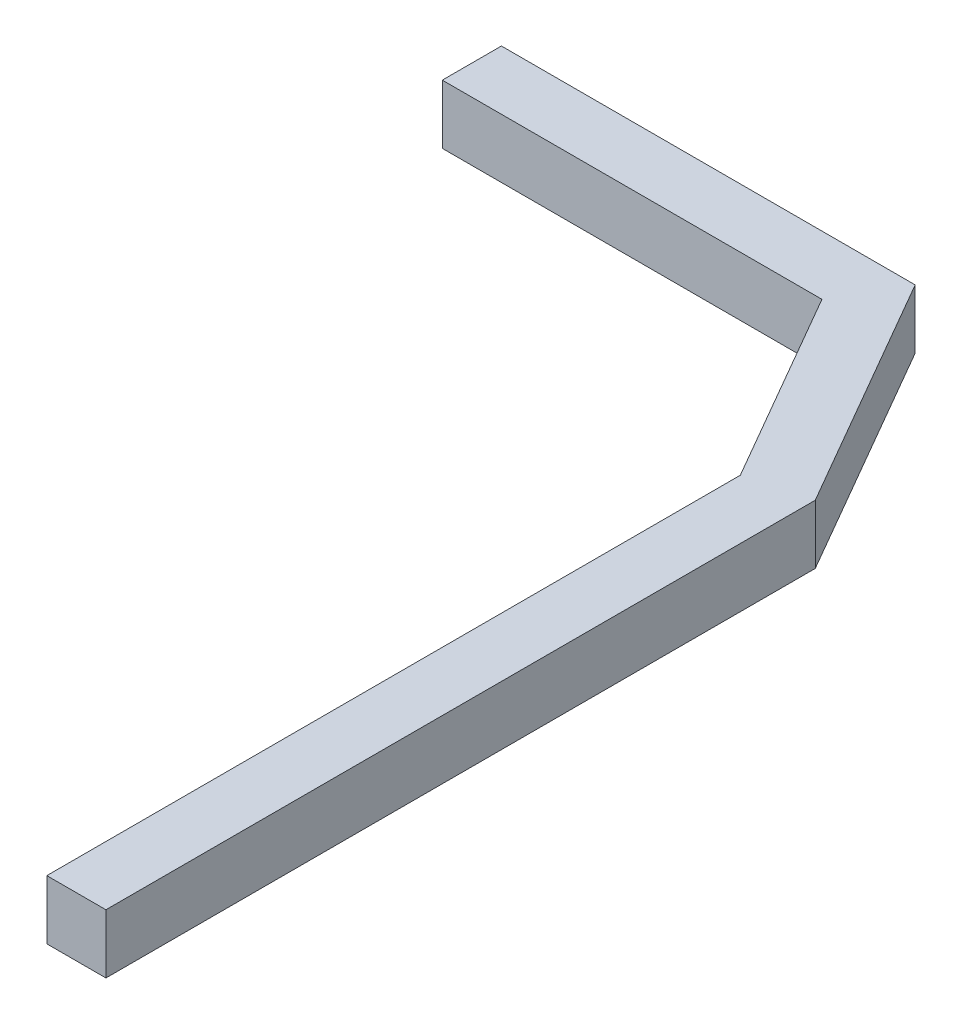
ISO-10303-21;
HEADER;
FILE_DESCRIPTION(('STEP AP214'),'2;1');
FILE_NAME('part.step','',(''),(''),'','','');
FILE_SCHEMA(('AUTOMOTIVE_DESIGN { 1 0 10303 214 1 1 1 1 }'));
ENDSEC;
DATA;
#1=APPLICATION_CONTEXT('core data for automotive mechanical design processes');
#2=APPLICATION_PROTOCOL_DEFINITION('international standard','automotive_design',2000,#1);
#3=PRODUCT_CONTEXT('',#1,'mechanical');
#4=PRODUCT('Part','Part','',(#3));
#5=PRODUCT_RELATED_PRODUCT_CATEGORY('part','',(#4));
#6=PRODUCT_DEFINITION_FORMATION('','',#4);
#7=PRODUCT_DEFINITION_CONTEXT('part definition',#1,'design');
#8=PRODUCT_DEFINITION('design','',#6,#7);
#9=PRODUCT_DEFINITION_SHAPE('','',#8);
#10=(LENGTH_UNIT() NAMED_UNIT(*) SI_UNIT(.MILLI.,.METRE.));
#11=(NAMED_UNIT(*) PLANE_ANGLE_UNIT() SI_UNIT($,.RADIAN.));
#12=(NAMED_UNIT(*) SI_UNIT($,.STERADIAN.) SOLID_ANGLE_UNIT());
#13=UNCERTAINTY_MEASURE_WITH_UNIT(LENGTH_MEASURE(1.E-05),#10,'distance_accuracy_value','');
#14=(GEOMETRIC_REPRESENTATION_CONTEXT(3) GLOBAL_UNCERTAINTY_ASSIGNED_CONTEXT((#13)) GLOBAL_UNIT_ASSIGNED_CONTEXT((#10,
#11,#12)) REPRESENTATION_CONTEXT('',''));
#15=CARTESIAN_POINT('',(0.,0.,0.));
#16=DIRECTION('',(0.,0.,1.));
#17=DIRECTION('',(1.,0.,0.));
#18=AXIS2_PLACEMENT_3D('',#15,#16,#17);
#19=CARTESIAN_POINT('',(-6.54700538379257,2.5,-80.));
#20=DIRECTION('',(0.,0.,1.));
#21=DIRECTION('',(1.,0.,0.));
#22=AXIS2_PLACEMENT_3D('',#19,#20,#21);
#23=PLANE('',#22);
#24=DIRECTION('',(-1.,0.,0.));
#25=VECTOR('',#24,1.);
#26=CARTESIAN_POINT('',(-6.54700538379257,-2.5,-80.));
#27=LINE('',#26,#25);
#28=CARTESIAN_POINT('',(-6.54700538379257,-2.5,-80.));
#29=VERTEX_POINT('',#28);
#30=CARTESIAN_POINT('',(-41.5470053837926,-2.5,-80.));
#31=VERTEX_POINT('',#30);
#32=EDGE_CURVE('E140',#29,#31,#27,.T.);
#33=ORIENTED_EDGE('',*,*,#32,.T.);
#34=DIRECTION('',(0.,-1.,0.));
#35=VECTOR('',#34,1.);
#36=CARTESIAN_POINT('',(-41.5470053837926,2.5,-80.));
#37=LINE('',#36,#35);
#38=CARTESIAN_POINT('',(-41.5470053837926,2.5,-80.));
#39=VERTEX_POINT('',#38);
#40=EDGE_CURVE('E11',#39,#31,#37,.T.);
#41=ORIENTED_EDGE('',*,*,#40,.F.);
#42=DIRECTION('',(-1.,0.,0.));
#43=VECTOR('',#42,1.);
#44=CARTESIAN_POINT('',(-6.54700538379257,2.5,-80.));
#45=LINE('',#44,#43);
#46=CARTESIAN_POINT('',(-6.54700538379257,2.5,-80.));
#47=VERTEX_POINT('',#46);
#48=EDGE_CURVE('E162',#47,#39,#45,.T.);
#49=ORIENTED_EDGE('',*,*,#48,.F.);
#50=DIRECTION('',(0.,-1.,0.));
#51=VECTOR('',#50,1.);
#52=CARTESIAN_POINT('',(-6.54700538379257,2.5,-80.));
#53=LINE('',#52,#51);
#54=EDGE_CURVE('E136',#47,#29,#53,.T.);
#55=ORIENTED_EDGE('',*,*,#54,.T.);
#56=EDGE_LOOP('',(#33,#41,#49,#55));
#57=FACE_BOUND('',#56,.T.);
#58=ADVANCED_FACE('F39',(#57),#23,.F.);
#59=CARTESIAN_POINT('',(-41.5470053837926,2.5,-80.));
#60=DIRECTION('',(1.,0.,0.));
#61=DIRECTION('',(0.,0.,-1.));
#62=AXIS2_PLACEMENT_3D('',#59,#60,#61);
#63=PLANE('',#62);
#64=DIRECTION('',(0.,0.,1.));
#65=VECTOR('',#64,1.);
#66=CARTESIAN_POINT('',(-41.5470053837926,-2.5,-80.));
#67=LINE('',#66,#65);
#68=CARTESIAN_POINT('',(-41.5470053837926,-2.5,-75.));
#69=VERTEX_POINT('',#68);
#70=EDGE_CURVE('E144',#31,#69,#67,.T.);
#71=ORIENTED_EDGE('',*,*,#70,.T.);
#72=DIRECTION('',(0.,-1.,0.));
#73=VECTOR('',#72,1.);
#74=CARTESIAN_POINT('',(-41.5470053837926,2.5,-75.));
#75=LINE('',#74,#73);
#76=CARTESIAN_POINT('',(-41.5470053837926,2.5,-75.));
#77=VERTEX_POINT('',#76);
#78=EDGE_CURVE('E48',#77,#69,#75,.T.);
#79=ORIENTED_EDGE('',*,*,#78,.F.);
#80=DIRECTION('',(0.,0.,1.));
#81=VECTOR('',#80,1.);
#82=CARTESIAN_POINT('',(-41.5470053837926,2.5,-80.));
#83=LINE('',#82,#81);
#84=EDGE_CURVE('E99',#39,#77,#83,.T.);
#85=ORIENTED_EDGE('',*,*,#84,.F.);
#86=ORIENTED_EDGE('',*,*,#40,.T.);
#87=EDGE_LOOP('',(#71,#79,#85,#86));
#88=FACE_BOUND('',#87,.T.);
#89=ADVANCED_FACE('F208',(#88),#63,.F.);
#90=CARTESIAN_POINT('',(-41.5470053837926,2.5,-75.));
#91=DIRECTION('',(0.,0.,-1.));
#92=DIRECTION('',(-1.,0.,0.));
#93=AXIS2_PLACEMENT_3D('',#90,#91,#92);
#94=PLANE('',#93);
#95=DIRECTION('',(1.,0.,0.));
#96=VECTOR('',#95,1.);
#97=CARTESIAN_POINT('',(-41.5470053837926,-2.5,-75.));
#98=LINE('',#97,#96);
#99=CARTESIAN_POINT('',(-9.43375672974069,-2.5,-75.));
#100=VERTEX_POINT('',#99);
#101=EDGE_CURVE('E147',#69,#100,#98,.T.);
#102=ORIENTED_EDGE('',*,*,#101,.T.);
#103=DIRECTION('',(0.,-1.,0.));
#104=VECTOR('',#103,1.);
#105=CARTESIAN_POINT('',(-9.43375672974069,2.5,-75.));
#106=LINE('',#105,#104);
#107=CARTESIAN_POINT('',(-9.43375672974069,2.5,-75.));
#108=VERTEX_POINT('',#107);
#109=EDGE_CURVE('E173',#108,#100,#106,.T.);
#110=ORIENTED_EDGE('',*,*,#109,.F.);
#111=DIRECTION('',(1.,0.,0.));
#112=VECTOR('',#111,1.);
#113=CARTESIAN_POINT('',(-41.5470053837926,2.5,-75.));
#114=LINE('',#113,#112);
#115=EDGE_CURVE('E183',#77,#108,#114,.T.);
#116=ORIENTED_EDGE('',*,*,#115,.F.);
#117=ORIENTED_EDGE('',*,*,#78,.T.);
#118=EDGE_LOOP('',(#102,#110,#116,#117));
#119=FACE_BOUND('',#118,.T.);
#120=ADVANCED_FACE('F181',(#119),#94,.F.);
#121=CARTESIAN_POINT('',(-9.43375672974069,2.5,-75.));
#122=DIRECTION('',(0.866025403784438,0.,-0.500000000000001));
#123=DIRECTION('',(-0.500000000000001,0.,-0.866025403784438));
#124=AXIS2_PLACEMENT_3D('',#121,#122,#123);
#125=PLANE('',#124);
#126=DIRECTION('',(0.500000000000001,0.,0.866025403784438));
#127=VECTOR('',#126,1.);
#128=CARTESIAN_POINT('',(-9.43375672974069,-2.5,-75.));
#129=LINE('',#128,#127);
#130=CARTESIAN_POINT('',(0.,-2.5,-58.6602540378444));
#131=VERTEX_POINT('',#130);
#132=EDGE_CURVE('E150',#100,#131,#129,.T.);
#133=ORIENTED_EDGE('',*,*,#132,.T.);
#134=DIRECTION('',(0.,-1.,0.));
#135=VECTOR('',#134,1.);
#136=CARTESIAN_POINT('',(0.,2.5,-58.6602540378444));
#137=LINE('',#136,#135);
#138=CARTESIAN_POINT('',(0.,2.5,-58.6602540378444));
#139=VERTEX_POINT('',#138);
#140=EDGE_CURVE('E169',#139,#131,#137,.T.);
#141=ORIENTED_EDGE('',*,*,#140,.F.);
#142=DIRECTION('',(0.500000000000001,0.,0.866025403784438));
#143=VECTOR('',#142,1.);
#144=CARTESIAN_POINT('',(-9.43375672974069,2.5,-75.));
#145=LINE('',#144,#143);
#146=EDGE_CURVE('E196',#108,#139,#145,.T.);
#147=ORIENTED_EDGE('',*,*,#146,.F.);
#148=ORIENTED_EDGE('',*,*,#109,.T.);
#149=EDGE_LOOP('',(#133,#141,#147,#148));
#150=FACE_BOUND('',#149,.T.);
#151=ADVANCED_FACE('F191',(#150),#125,.F.);
#152=CARTESIAN_POINT('',(0.,2.5,-58.6602540378444));
#153=DIRECTION('',(1.,0.,0.));
#154=DIRECTION('',(0.,0.,-1.));
#155=AXIS2_PLACEMENT_3D('',#152,#153,#154);
#156=PLANE('',#155);
#157=DIRECTION('',(0.,0.,1.));
#158=VECTOR('',#157,1.);
#159=CARTESIAN_POINT('',(0.,-2.5,-58.6602540378444));
#160=LINE('',#159,#158);
#161=CARTESIAN_POINT('',(0.,-2.5,0.));
#162=VERTEX_POINT('',#161);
#163=EDGE_CURVE('E153',#131,#162,#160,.T.);
#164=ORIENTED_EDGE('',*,*,#163,.T.);
#165=DIRECTION('',(0.,-1.,0.));
#166=VECTOR('',#165,1.);
#167=CARTESIAN_POINT('',(0.,2.5,0.));
#168=LINE('',#167,#166);
#169=CARTESIAN_POINT('',(0.,2.5,0.));
#170=VERTEX_POINT('',#169);
#171=EDGE_CURVE('E129',#170,#162,#168,.T.);
#172=ORIENTED_EDGE('',*,*,#171,.F.);
#173=DIRECTION('',(0.,0.,1.));
#174=VECTOR('',#173,1.);
#175=CARTESIAN_POINT('',(0.,2.5,-58.6602540378444));
#176=LINE('',#175,#174);
#177=EDGE_CURVE('E118',#139,#170,#176,.T.);
#178=ORIENTED_EDGE('',*,*,#177,.F.);
#179=ORIENTED_EDGE('',*,*,#140,.T.);
#180=EDGE_LOOP('',(#164,#172,#178,#179));
#181=FACE_BOUND('',#180,.T.);
#182=ADVANCED_FACE('F194',(#181),#156,.F.);
#183=CARTESIAN_POINT('',(0.,2.5,0.));
#184=DIRECTION('',(0.,0.,-1.));
#185=DIRECTION('',(-1.,0.,0.));
#186=AXIS2_PLACEMENT_3D('',#183,#184,#185);
#187=PLANE('',#186);
#188=DIRECTION('',(1.,0.,0.));
#189=VECTOR('',#188,1.);
#190=CARTESIAN_POINT('',(0.,-2.5,0.));
#191=LINE('',#190,#189);
#192=CARTESIAN_POINT('',(5.,-2.5,0.));
#193=VERTEX_POINT('',#192);
#194=EDGE_CURVE('E127',#162,#193,#191,.T.);
#195=ORIENTED_EDGE('',*,*,#194,.T.);
#196=DIRECTION('',(0.,-1.,0.));
#197=VECTOR('',#196,1.);
#198=CARTESIAN_POINT('',(5.,2.5,0.));
#199=LINE('',#198,#197);
#200=CARTESIAN_POINT('',(5.,2.5,0.));
#201=VERTEX_POINT('',#200);
#202=EDGE_CURVE('E124',#201,#193,#199,.T.);
#203=ORIENTED_EDGE('',*,*,#202,.F.);
#204=DIRECTION('',(1.,0.,0.));
#205=VECTOR('',#204,1.);
#206=CARTESIAN_POINT('',(0.,2.5,0.));
#207=LINE('',#206,#205);
#208=EDGE_CURVE('E112',#170,#201,#207,.T.);
#209=ORIENTED_EDGE('',*,*,#208,.F.);
#210=ORIENTED_EDGE('',*,*,#171,.T.);
#211=EDGE_LOOP('',(#195,#203,#209,#210));
#212=FACE_BOUND('',#211,.T.);
#213=ADVANCED_FACE('F125',(#212),#187,.F.);
#214=CARTESIAN_POINT('',(5.,2.5,0.));
#215=DIRECTION('',(-1.,0.,0.));
#216=DIRECTION('',(0.,0.,1.));
#217=AXIS2_PLACEMENT_3D('',#214,#215,#216);
#218=PLANE('',#217);
#219=DIRECTION('',(0.,0.,-1.));
#220=VECTOR('',#219,1.);
#221=CARTESIAN_POINT('',(5.,-2.5,0.));
#222=LINE('',#221,#220);
#223=CARTESIAN_POINT('',(5.,-2.5,-60.));
#224=VERTEX_POINT('',#223);
#225=EDGE_CURVE('E85',#193,#224,#222,.T.);
#226=ORIENTED_EDGE('',*,*,#225,.T.);
#227=DIRECTION('',(0.,-1.,0.));
#228=VECTOR('',#227,1.);
#229=CARTESIAN_POINT('',(5.,2.5,-60.));
#230=LINE('',#229,#228);
#231=CARTESIAN_POINT('',(5.,2.5,-60.));
#232=VERTEX_POINT('',#231);
#233=EDGE_CURVE('E130',#232,#224,#230,.T.);
#234=ORIENTED_EDGE('',*,*,#233,.F.);
#235=DIRECTION('',(0.,0.,-1.));
#236=VECTOR('',#235,1.);
#237=CARTESIAN_POINT('',(5.,2.5,0.));
#238=LINE('',#237,#236);
#239=EDGE_CURVE('E116',#201,#232,#238,.T.);
#240=ORIENTED_EDGE('',*,*,#239,.F.);
#241=ORIENTED_EDGE('',*,*,#202,.T.);
#242=EDGE_LOOP('',(#226,#234,#240,#241));
#243=FACE_BOUND('',#242,.T.);
#244=ADVANCED_FACE('F132',(#243),#218,.F.);
#245=CARTESIAN_POINT('',(5.,2.5,-60.));
#246=DIRECTION('',(-0.866025403784437,0.,0.500000000000002));
#247=DIRECTION('',(0.500000000000002,0.,0.866025403784437));
#248=AXIS2_PLACEMENT_3D('',#245,#246,#247);
#249=PLANE('',#248);
#250=DIRECTION('',(-0.500000000000002,0.,-0.866025403784437));
#251=VECTOR('',#250,1.);
#252=CARTESIAN_POINT('',(5.,-2.5,-60.));
#253=LINE('',#252,#251);
#254=EDGE_CURVE('E91',#224,#29,#253,.T.);
#255=ORIENTED_EDGE('',*,*,#254,.T.);
#256=ORIENTED_EDGE('',*,*,#54,.F.);
#257=DIRECTION('',(-0.500000000000002,0.,-0.866025403784437));
#258=VECTOR('',#257,1.);
#259=CARTESIAN_POINT('',(5.,2.5,-60.));
#260=LINE('',#259,#258);
#261=EDGE_CURVE('E56',#232,#47,#260,.T.);
#262=ORIENTED_EDGE('',*,*,#261,.F.);
#263=ORIENTED_EDGE('',*,*,#233,.T.);
#264=EDGE_LOOP('',(#255,#256,#262,#263));
#265=FACE_BOUND('',#264,.T.);
#266=ADVANCED_FACE('F224',(#265),#249,.F.);
#267=CARTESIAN_POINT('',(0.,2.5,0.));
#268=DIRECTION('',(0.,1.,0.));
#269=DIRECTION('',(0.,0.,1.));
#270=AXIS2_PLACEMENT_3D('',#267,#268,#269);
#271=PLANE('',#270);
#272=ORIENTED_EDGE('',*,*,#48,.T.);
#273=ORIENTED_EDGE('',*,*,#84,.T.);
#274=ORIENTED_EDGE('',*,*,#115,.T.);
#275=ORIENTED_EDGE('',*,*,#146,.T.);
#276=ORIENTED_EDGE('',*,*,#177,.T.);
#277=ORIENTED_EDGE('',*,*,#208,.T.);
#278=ORIENTED_EDGE('',*,*,#239,.T.);
#279=ORIENTED_EDGE('',*,*,#261,.T.);
#280=EDGE_LOOP('',(#272,#273,#274,#275,#276,#277,#278,#279));
#281=FACE_BOUND('',#280,.T.);
#282=ADVANCED_FACE('F114',(#281),#271,.T.);
#283=CARTESIAN_POINT('',(0.,-2.5,0.));
#284=DIRECTION('',(0.,1.,0.));
#285=DIRECTION('',(0.,0.,1.));
#286=AXIS2_PLACEMENT_3D('',#283,#284,#285);
#287=PLANE('',#286);
#288=ORIENTED_EDGE('',*,*,#32,.F.);
#289=ORIENTED_EDGE('',*,*,#254,.F.);
#290=ORIENTED_EDGE('',*,*,#225,.F.);
#291=ORIENTED_EDGE('',*,*,#194,.F.);
#292=ORIENTED_EDGE('',*,*,#163,.F.);
#293=ORIENTED_EDGE('',*,*,#132,.F.);
#294=ORIENTED_EDGE('',*,*,#101,.F.);
#295=ORIENTED_EDGE('',*,*,#70,.F.);
#296=EDGE_LOOP('',(#288,#289,#290,#291,#292,#293,#294,#295));
#297=FACE_BOUND('',#296,.T.);
#298=ADVANCED_FACE('F187',(#297),#287,.F.);
#299=CLOSED_SHELL('',(#58,#89,#120,#151,#182,#213,#244,#266,#282,#298));
#300=MANIFOLD_SOLID_BREP('B2',#299);
#301=ADVANCED_BREP_SHAPE_REPRESENTATION('',(#18,#300),#14);
#302=SHAPE_DEFINITION_REPRESENTATION(#9,#301);
ENDSEC;
END-ISO-10303-21;
